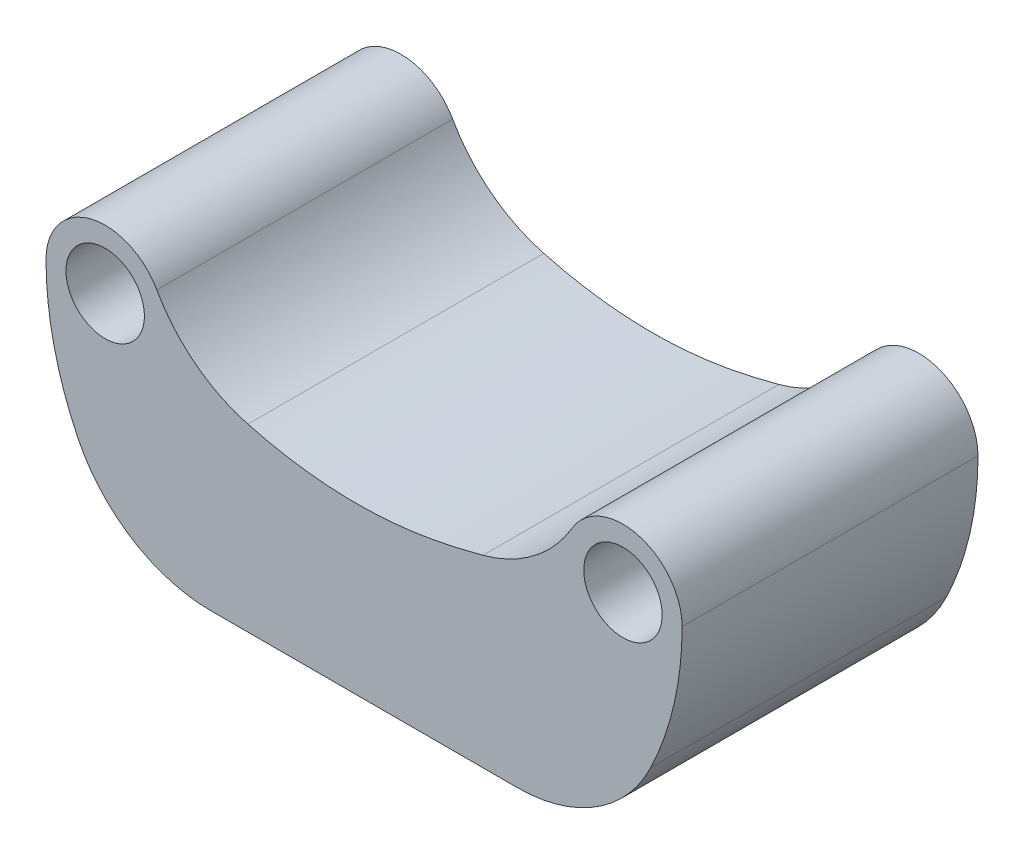
ISO-10303-21;
HEADER;
FILE_DESCRIPTION(('STEP AP214'),'2;1');
FILE_NAME('part.step','',(''),(''),'','','');
FILE_SCHEMA(('AUTOMOTIVE_DESIGN { 1 0 10303 214 1 1 1 1 }'));
ENDSEC;
DATA;
#1=APPLICATION_CONTEXT('core data for automotive mechanical design processes');
#2=APPLICATION_PROTOCOL_DEFINITION('international standard','automotive_design',2000,#1);
#3=PRODUCT_CONTEXT('',#1,'mechanical');
#4=PRODUCT('Part','Part','',(#3));
#5=PRODUCT_RELATED_PRODUCT_CATEGORY('part','',(#4));
#6=PRODUCT_DEFINITION_FORMATION('','',#4);
#7=PRODUCT_DEFINITION_CONTEXT('part definition',#1,'design');
#8=PRODUCT_DEFINITION('design','',#6,#7);
#9=PRODUCT_DEFINITION_SHAPE('','',#8);
#10=(LENGTH_UNIT() NAMED_UNIT(*) SI_UNIT(.MILLI.,.METRE.));
#11=(NAMED_UNIT(*) PLANE_ANGLE_UNIT() SI_UNIT($,.RADIAN.));
#12=(NAMED_UNIT(*) SI_UNIT($,.STERADIAN.) SOLID_ANGLE_UNIT());
#13=UNCERTAINTY_MEASURE_WITH_UNIT(LENGTH_MEASURE(1.E-05),#10,'distance_accuracy_value','');
#14=(GEOMETRIC_REPRESENTATION_CONTEXT(3) GLOBAL_UNCERTAINTY_ASSIGNED_CONTEXT((#13)) GLOBAL_UNIT_ASSIGNED_CONTEXT((#10,
#11,#12)) REPRESENTATION_CONTEXT('',''));
#15=CARTESIAN_POINT('',(0.,0.,0.));
#16=DIRECTION('',(0.,0.,1.));
#17=DIRECTION('',(1.,0.,0.));
#18=AXIS2_PLACEMENT_3D('',#15,#16,#17);
#19=CARTESIAN_POINT('',(0.,0.,0.));
#20=DIRECTION('',(0.,0.,1.));
#21=DIRECTION('',(1.,0.,0.));
#22=AXIS2_PLACEMENT_3D('',#19,#20,#21);
#23=PLANE('',#22);
#24=CARTESIAN_POINT('',(0.,0.,0.));
#25=DIRECTION('',(0.,0.,1.));
#26=DIRECTION('',(1.,0.,0.));
#27=AXIS2_PLACEMENT_3D('',#24,#25,#26);
#28=CIRCLE('',#27,21.5);
#29=CARTESIAN_POINT('',(19.361512013477,-9.34782608695651,0.));
#30=VERTEX_POINT('',#29);
#31=CARTESIAN_POINT('',(21.5,0.,0.));
#32=VERTEX_POINT('',#31);
#33=EDGE_CURVE('E120',#30,#32,#28,.T.);
#34=ORIENTED_EDGE('',*,*,#33,.F.);
#35=CARTESIAN_POINT('',(10.356157588604,-5.,0.));
#36=DIRECTION('',(0.,0.,1.));
#37=DIRECTION('',(1.,0.,0.));
#38=AXIS2_PLACEMENT_3D('',#35,#36,#37);
#39=CIRCLE('',#38,10.);
#40=CARTESIAN_POINT('',(10.356157588604,-15.,0.));
#41=VERTEX_POINT('',#40);
#42=EDGE_CURVE('E279',#30,#41,#39,.F.);
#43=ORIENTED_EDGE('',*,*,#42,.T.);
#44=DIRECTION('',(1.,0.,0.));
#45=VECTOR('',#44,1.);
#46=CARTESIAN_POINT('',(-15.4029218007494,-15.,0.));
#47=LINE('',#46,#45);
#48=CARTESIAN_POINT('',(-10.356157588604,-15.,0.));
#49=VERTEX_POINT('',#48);
#50=EDGE_CURVE('E162',#49,#41,#47,.T.);
#51=ORIENTED_EDGE('',*,*,#50,.F.);
#52=CARTESIAN_POINT('',(-10.356157588604,-5.,0.));
#53=DIRECTION('',(0.,0.,1.));
#54=DIRECTION('',(1.,0.,0.));
#55=AXIS2_PLACEMENT_3D('',#52,#53,#54);
#56=CIRCLE('',#55,10.);
#57=CARTESIAN_POINT('',(-19.361512013477,-9.34782608695652,0.));
#58=VERTEX_POINT('',#57);
#59=EDGE_CURVE('E280',#49,#58,#56,.F.);
#60=ORIENTED_EDGE('',*,*,#59,.T.);
#61=CARTESIAN_POINT('',(0.,0.,0.));
#62=DIRECTION('',(0.,0.,1.));
#63=DIRECTION('',(1.,0.,0.));
#64=AXIS2_PLACEMENT_3D('',#61,#62,#63);
#65=CIRCLE('',#64,21.5);
#66=CARTESIAN_POINT('',(-21.5,0.,0.));
#67=VERTEX_POINT('',#66);
#68=EDGE_CURVE('E163',#67,#58,#65,.T.);
#69=ORIENTED_EDGE('',*,*,#68,.F.);
#70=CARTESIAN_POINT('',(-17.5,0.,0.));
#71=DIRECTION('',(0.,0.,1.));
#72=DIRECTION('',(1.,0.,0.));
#73=AXIS2_PLACEMENT_3D('',#70,#71,#72);
#74=CIRCLE('',#73,4.);
#75=CARTESIAN_POINT('',(-14.009724205155,1.95396388807956,0.));
#76=VERTEX_POINT('',#75);
#77=EDGE_CURVE('E159',#76,#67,#74,.T.);
#78=ORIENTED_EDGE('',*,*,#77,.F.);
#79=CARTESIAN_POINT('',(-5.28403471804245,6.83887360827846,0.));
#80=DIRECTION('',(0.,0.,-1.));
#81=DIRECTION('',(-1.,0.,0.));
#82=AXIS2_PLACEMENT_3D('',#79,#80,#81);
#83=CIRCLE('',#82,10.);
#84=CARTESIAN_POINT('',(-7.85249918215622,-2.82564864047159,0.));
#85=VERTEX_POINT('',#84);
#86=EDGE_CURVE('E155',#85,#76,#83,.T.);
#87=ORIENTED_EDGE('',*,*,#86,.F.);
#88=CARTESIAN_POINT('',(8.04085902458629,-2.55556091291982,0.));
#89=CARTESIAN_POINT('',(5.05697754250554,-3.36160943568467,0.));
#90=CARTESIAN_POINT('',(0.144262576165083,-4.13298074414916,0.));
#91=CARTESIAN_POINT('',(-5.06311863946979,-3.56696048355903,0.));
#92=CARTESIAN_POINT('',(-7.85249918215622,-2.82564864047159,0.));
#93=B_SPLINE_CURVE_WITH_KNOTS('',3,(#88,#89,#90,#91,#92),.UNSPECIFIED.,.F.,.F.,(4,1,4),
(0.17012461896422,0.514602549110944,0.849602566286318),.UNSPECIFIED.);
#94=CARTESIAN_POINT('',(8.04085902458629,-2.55556091291981,0.));
#95=VERTEX_POINT('',#94);
#96=EDGE_CURVE('E150',#95,#85,#93,.T.);
#97=ORIENTED_EDGE('',*,*,#96,.F.);
#98=CARTESIAN_POINT('',(5.4329927307142,7.09840373344625,0.));
#99=DIRECTION('',(0.,0.,-1.));
#100=DIRECTION('',(1.,0.,0.));
#101=AXIS2_PLACEMENT_3D('',#98,#99,#100);
#102=CIRCLE('',#101,10.);
#103=CARTESIAN_POINT('',(14.0522836373469,2.02811535241322,0.));
#104=VERTEX_POINT('',#103);
#105=EDGE_CURVE('E130',#104,#95,#102,.T.);
#106=ORIENTED_EDGE('',*,*,#105,.F.);
#107=CARTESIAN_POINT('',(17.5,0.,0.));
#108=DIRECTION('',(0.,0.,1.));
#109=DIRECTION('',(1.,0.,0.));
#110=AXIS2_PLACEMENT_3D('',#107,#108,#109);
#111=CIRCLE('',#110,4.);
#112=EDGE_CURVE('E126',#32,#104,#111,.T.);
#113=ORIENTED_EDGE('',*,*,#112,.F.);
#114=EDGE_LOOP('',(#34,#43,#51,#60,#69,#78,#87,#97,#106,#113));
#115=FACE_BOUND('',#114,.T.);
#116=CARTESIAN_POINT('',(-17.5,0.,0.));
#117=DIRECTION('',(0.,0.,1.));
#118=DIRECTION('',(1.,0.,0.));
#119=AXIS2_PLACEMENT_3D('',#116,#117,#118);
#120=CIRCLE('',#119,2.65);
#121=CARTESIAN_POINT('',(-14.85,0.,0.));
#122=VERTEX_POINT('',#121);
#123=EDGE_CURVE('E248',#122,#122,#120,.T.);
#124=ORIENTED_EDGE('',*,*,#123,.T.);
#125=EDGE_LOOP('',(#124));
#126=FACE_BOUND('',#125,.T.);
#127=CARTESIAN_POINT('',(17.5,0.,0.));
#128=DIRECTION('',(0.,0.,1.));
#129=DIRECTION('',(1.,0.,0.));
#130=AXIS2_PLACEMENT_3D('',#127,#128,#129);
#131=CIRCLE('',#130,2.65);
#132=CARTESIAN_POINT('',(20.15,0.,0.));
#133=VERTEX_POINT('',#132);
#134=EDGE_CURVE('E243',#133,#133,#131,.T.);
#135=ORIENTED_EDGE('',*,*,#134,.T.);
#136=EDGE_LOOP('',(#135));
#137=FACE_BOUND('',#136,.T.);
#138=ADVANCED_FACE('F33',(#115,#126,#137),#23,.F.);
#139=CARTESIAN_POINT('',(0.,0.,67.0106370941726));
#140=DIRECTION('',(0.,0.,-1.));
#141=DIRECTION('',(-1.,0.,0.));
#142=AXIS2_PLACEMENT_3D('',#139,#140,#141);
#143=CYLINDRICAL_SURFACE('',#142,21.5);
#144=CARTESIAN_POINT('',(0.,0.,20.));
#145=DIRECTION('',(0.,0.,-1.));
#146=DIRECTION('',(-1.,0.,0.));
#147=AXIS2_PLACEMENT_3D('',#144,#145,#146);
#148=CIRCLE('',#147,21.5);
#149=CARTESIAN_POINT('',(21.5,0.,20.));
#150=VERTEX_POINT('',#149);
#151=CARTESIAN_POINT('',(19.361512013477,-9.34782608695651,20.));
#152=VERTEX_POINT('',#151);
#153=EDGE_CURVE('E115',#150,#152,#148,.T.);
#154=ORIENTED_EDGE('',*,*,#153,.T.);
#155=DIRECTION('',(0.,0.,-1.));
#156=VECTOR('',#155,1.);
#157=CARTESIAN_POINT('',(19.361512013477,-9.34782608695651,67.0106370941726));
#158=LINE('',#157,#156);
#159=EDGE_CURVE('E167',#152,#30,#158,.T.);
#160=ORIENTED_EDGE('',*,*,#159,.T.);
#161=ORIENTED_EDGE('',*,*,#33,.T.);
#162=DIRECTION('',(0.,0.,-1.));
#163=VECTOR('',#162,1.);
#164=CARTESIAN_POINT('',(21.5,0.,67.0106370941726));
#165=LINE('',#164,#163);
#166=EDGE_CURVE('E119',#150,#32,#165,.T.);
#167=ORIENTED_EDGE('',*,*,#166,.F.);
#168=EDGE_LOOP('',(#154,#160,#161,#167));
#169=FACE_BOUND('',#168,.T.);
#170=ADVANCED_FACE('F191',(#169),#143,.T.);
#171=CARTESIAN_POINT('',(17.5,0.,67.0106370941726));
#172=DIRECTION('',(0.,0.,-1.));
#173=DIRECTION('',(-1.,0.,0.));
#174=AXIS2_PLACEMENT_3D('',#171,#172,#173);
#175=CYLINDRICAL_SURFACE('',#174,4.);
#176=DIRECTION('',(0.,0.,-1.));
#177=VECTOR('',#176,1.);
#178=CARTESIAN_POINT('',(14.0522836373469,2.02811535241322,67.0106370941726));
#179=LINE('',#178,#177);
#180=CARTESIAN_POINT('',(14.0522836373469,2.02811535241322,20.));
#181=VERTEX_POINT('',#180);
#182=EDGE_CURVE('E123',#181,#104,#179,.T.);
#183=ORIENTED_EDGE('',*,*,#182,.F.);
#184=CARTESIAN_POINT('',(17.5,0.,20.));
#185=DIRECTION('',(0.,0.,-1.));
#186=DIRECTION('',(-1.,0.,0.));
#187=AXIS2_PLACEMENT_3D('',#184,#185,#186);
#188=CIRCLE('',#187,4.);
#189=EDGE_CURVE('E108',#181,#150,#188,.T.);
#190=ORIENTED_EDGE('',*,*,#189,.T.);
#191=ORIENTED_EDGE('',*,*,#166,.T.);
#192=ORIENTED_EDGE('',*,*,#112,.T.);
#193=EDGE_LOOP('',(#183,#190,#191,#192));
#194=FACE_BOUND('',#193,.T.);
#195=ADVANCED_FACE('F124',(#194),#175,.T.);
#196=CARTESIAN_POINT('',(5.4329927307142,7.09840373344625,67.0106370941726));
#197=DIRECTION('',(0.,0.,-1.));
#198=DIRECTION('',(-1.,0.,0.));
#199=AXIS2_PLACEMENT_3D('',#196,#197,#198);
#200=CYLINDRICAL_SURFACE('',#199,10.);
#201=DIRECTION('',(0.,0.,-1.));
#202=VECTOR('',#201,1.);
#203=CARTESIAN_POINT('',(8.04085902458629,-2.55556091291981,67.0106370941726));
#204=LINE('',#203,#202);
#205=CARTESIAN_POINT('',(8.04085902458629,-2.55556091291982,20.));
#206=VERTEX_POINT('',#205);
#207=EDGE_CURVE('E133',#206,#95,#204,.T.);
#208=ORIENTED_EDGE('',*,*,#207,.F.);
#209=CARTESIAN_POINT('',(5.4329927307142,7.09840373344625,20.));
#210=DIRECTION('',(0.,0.,-1.));
#211=DIRECTION('',(-1.,0.,0.));
#212=AXIS2_PLACEMENT_3D('',#209,#210,#211);
#213=CIRCLE('',#212,10.);
#214=EDGE_CURVE('E112',#206,#181,#213,.F.);
#215=ORIENTED_EDGE('',*,*,#214,.T.);
#216=ORIENTED_EDGE('',*,*,#182,.T.);
#217=ORIENTED_EDGE('',*,*,#105,.T.);
#218=EDGE_LOOP('',(#208,#215,#216,#217));
#219=FACE_BOUND('',#218,.T.);
#220=ADVANCED_FACE('F132',(#219),#200,.F.);
#221=CARTESIAN_POINT('',(8.04085902458629,-2.55556091291982,67.0106370941726));
#222=CARTESIAN_POINT('',(5.05697754250554,-3.36160943568467,67.0106370941726));
#223=CARTESIAN_POINT('',(0.144262576165083,-4.13298074414916,67.0106370941726));
#224=CARTESIAN_POINT('',(-5.06311863946979,-3.56696048355903,67.0106370941726));
#225=CARTESIAN_POINT('',(-7.85249918215622,-2.82564864047159,67.0106370941726));
#226=B_SPLINE_CURVE_WITH_KNOTS('',3,(#221,#222,#223,#224,#225),.UNSPECIFIED.,.F.,.F.,(4,1,4),
(0.17012461896422,0.514602549110944,0.849602566286318),.UNSPECIFIED.);
#227=DIRECTION('',(0.,0.,-1.));
#228=VECTOR('',#227,1.);
#229=SURFACE_OF_LINEAR_EXTRUSION('',#226,#228);
#230=DIRECTION('',(0.,0.,-1.));
#231=VECTOR('',#230,1.);
#232=CARTESIAN_POINT('',(-7.85249918215622,-2.82564864047159,67.0106370941726));
#233=LINE('',#232,#231);
#234=CARTESIAN_POINT('',(-7.85249918215622,-2.82564864047159,20.));
#235=VERTEX_POINT('',#234);
#236=EDGE_CURVE('E149',#235,#85,#233,.T.);
#237=ORIENTED_EDGE('',*,*,#236,.F.);
#238=CARTESIAN_POINT('',(8.04085902458629,-2.55556091291982,20.));
#239=CARTESIAN_POINT('',(5.05697754250554,-3.36160943568467,20.));
#240=CARTESIAN_POINT('',(0.144262576165083,-4.13298074414916,20.));
#241=CARTESIAN_POINT('',(-5.06311863946979,-3.56696048355903,20.));
#242=CARTESIAN_POINT('',(-7.85249918215622,-2.82564864047159,20.));
#243=B_SPLINE_CURVE_WITH_KNOTS('',3,(#238,#239,#240,#241,#242),.UNSPECIFIED.,.F.,.F.,(4,1,4),
(0.17012461896422,0.514602549110944,0.849602566286318),.UNSPECIFIED.);
#244=EDGE_CURVE('E139',#235,#206,#243,.F.);
#245=ORIENTED_EDGE('',*,*,#244,.T.);
#246=ORIENTED_EDGE('',*,*,#207,.T.);
#247=ORIENTED_EDGE('',*,*,#96,.T.);
#248=EDGE_LOOP('',(#237,#245,#246,#247));
#249=FACE_BOUND('',#248,.T.);
#250=ADVANCED_FACE('F180',(#249),#229,.F.);
#251=CARTESIAN_POINT('',(-5.28403471804245,6.83887360827846,67.0106370941726));
#252=DIRECTION('',(0.,0.,-1.));
#253=DIRECTION('',(-1.,0.,0.));
#254=AXIS2_PLACEMENT_3D('',#251,#252,#253);
#255=CYLINDRICAL_SURFACE('',#254,10.);
#256=DIRECTION('',(0.,0.,-1.));
#257=VECTOR('',#256,1.);
#258=CARTESIAN_POINT('',(-14.009724205155,1.95396388807956,67.0106370941726));
#259=LINE('',#258,#257);
#260=CARTESIAN_POINT('',(-14.009724205155,1.95396388807956,20.));
#261=VERTEX_POINT('',#260);
#262=EDGE_CURVE('E154',#261,#76,#259,.T.);
#263=ORIENTED_EDGE('',*,*,#262,.F.);
#264=CARTESIAN_POINT('',(-5.28403471804245,6.83887360827846,20.));
#265=DIRECTION('',(0.,0.,-1.));
#266=DIRECTION('',(-1.,0.,0.));
#267=AXIS2_PLACEMENT_3D('',#264,#265,#266);
#268=CIRCLE('',#267,10.);
#269=EDGE_CURVE('E143',#261,#235,#268,.F.);
#270=ORIENTED_EDGE('',*,*,#269,.T.);
#271=ORIENTED_EDGE('',*,*,#236,.T.);
#272=ORIENTED_EDGE('',*,*,#86,.T.);
#273=EDGE_LOOP('',(#263,#270,#271,#272));
#274=FACE_BOUND('',#273,.T.);
#275=ADVANCED_FACE('F184',(#274),#255,.F.);
#276=CARTESIAN_POINT('',(-17.5,0.,67.0106370941726));
#277=DIRECTION('',(0.,0.,-1.));
#278=DIRECTION('',(-1.,0.,0.));
#279=AXIS2_PLACEMENT_3D('',#276,#277,#278);
#280=CYLINDRICAL_SURFACE('',#279,4.);
#281=DIRECTION('',(0.,0.,-1.));
#282=VECTOR('',#281,1.);
#283=CARTESIAN_POINT('',(-21.5,0.,67.0106370941726));
#284=LINE('',#283,#282);
#285=CARTESIAN_POINT('',(-21.5,0.,20.));
#286=VERTEX_POINT('',#285);
#287=EDGE_CURVE('E158',#286,#67,#284,.T.);
#288=ORIENTED_EDGE('',*,*,#287,.F.);
#289=CARTESIAN_POINT('',(-17.5,0.,20.));
#290=DIRECTION('',(0.,0.,-1.));
#291=DIRECTION('',(-1.,0.,0.));
#292=AXIS2_PLACEMENT_3D('',#289,#290,#291);
#293=CIRCLE('',#292,4.);
#294=EDGE_CURVE('E151',#286,#261,#293,.T.);
#295=ORIENTED_EDGE('',*,*,#294,.T.);
#296=ORIENTED_EDGE('',*,*,#262,.T.);
#297=ORIENTED_EDGE('',*,*,#77,.T.);
#298=EDGE_LOOP('',(#288,#295,#296,#297));
#299=FACE_BOUND('',#298,.T.);
#300=ADVANCED_FACE('F227',(#299),#280,.T.);
#301=CARTESIAN_POINT('',(0.,0.,67.0106370941726));
#302=DIRECTION('',(0.,0.,-1.));
#303=DIRECTION('',(-1.,0.,0.));
#304=AXIS2_PLACEMENT_3D('',#301,#302,#303);
#305=CYLINDRICAL_SURFACE('',#304,21.5);
#306=ORIENTED_EDGE('',*,*,#68,.T.);
#307=DIRECTION('',(0.,0.,-1.));
#308=VECTOR('',#307,1.);
#309=CARTESIAN_POINT('',(-19.361512013477,-9.34782608695652,67.0106370941726));
#310=LINE('',#309,#308);
#311=CARTESIAN_POINT('',(-19.361512013477,-9.34782608695652,20.));
#312=VERTEX_POINT('',#311);
#313=EDGE_CURVE('E11',#58,#312,#310,.F.);
#314=ORIENTED_EDGE('',*,*,#313,.T.);
#315=CARTESIAN_POINT('',(0.,0.,20.));
#316=DIRECTION('',(0.,0.,-1.));
#317=DIRECTION('',(-1.,0.,0.));
#318=AXIS2_PLACEMENT_3D('',#315,#316,#317);
#319=CIRCLE('',#318,21.5);
#320=EDGE_CURVE('E156',#312,#286,#319,.T.);
#321=ORIENTED_EDGE('',*,*,#320,.T.);
#322=ORIENTED_EDGE('',*,*,#287,.T.);
#323=EDGE_LOOP('',(#306,#314,#321,#322));
#324=FACE_BOUND('',#323,.T.);
#325=ADVANCED_FACE('F224',(#324),#305,.T.);
#326=CARTESIAN_POINT('',(-15.4029218007494,-15.,67.0106370941726));
#327=DIRECTION('',(0.,1.,0.));
#328=DIRECTION('',(-1.,0.,0.));
#329=AXIS2_PLACEMENT_3D('',#326,#327,#328);
#330=PLANE('',#329);
#331=ORIENTED_EDGE('',*,*,#50,.T.);
#332=DIRECTION('',(0.,0.,-1.));
#333=VECTOR('',#332,1.);
#334=CARTESIAN_POINT('',(10.356157588604,-15.,67.0106370941726));
#335=LINE('',#334,#333);
#336=CARTESIAN_POINT('',(10.356157588604,-15.,20.));
#337=VERTEX_POINT('',#336);
#338=EDGE_CURVE('E274',#41,#337,#335,.F.);
#339=ORIENTED_EDGE('',*,*,#338,.T.);
#340=DIRECTION('',(-1.,0.,0.));
#341=VECTOR('',#340,1.);
#342=CARTESIAN_POINT('',(-15.4029218007494,-15.,20.));
#343=LINE('',#342,#341);
#344=CARTESIAN_POINT('',(-10.356157588604,-15.,20.));
#345=VERTEX_POINT('',#344);
#346=EDGE_CURVE('E160',#337,#345,#343,.T.);
#347=ORIENTED_EDGE('',*,*,#346,.T.);
#348=DIRECTION('',(0.,0.,-1.));
#349=VECTOR('',#348,1.);
#350=CARTESIAN_POINT('',(-10.356157588604,-15.,67.0106370941726));
#351=LINE('',#350,#349);
#352=EDGE_CURVE('E273',#345,#49,#351,.T.);
#353=ORIENTED_EDGE('',*,*,#352,.T.);
#354=EDGE_LOOP('',(#331,#339,#347,#353));
#355=FACE_BOUND('',#354,.T.);
#356=ADVANCED_FACE('F199',(#355),#330,.F.);
#357=CARTESIAN_POINT('',(-17.5,0.,67.0106370941726));
#358=DIRECTION('',(0.,0.,-1.));
#359=DIRECTION('',(-1.,0.,0.));
#360=AXIS2_PLACEMENT_3D('',#357,#358,#359);
#361=CYLINDRICAL_SURFACE('',#360,2.65);
#362=CARTESIAN_POINT('',(-17.5,0.,20.));
#363=DIRECTION('',(0.,0.,-1.));
#364=DIRECTION('',(-1.,0.,0.));
#365=AXIS2_PLACEMENT_3D('',#362,#363,#364);
#366=CIRCLE('',#365,2.65);
#367=CARTESIAN_POINT('',(-20.15,0.,20.));
#368=VERTEX_POINT('',#367);
#369=EDGE_CURVE('E164',#368,#368,#366,.T.);
#370=ORIENTED_EDGE('',*,*,#369,.F.);
#371=EDGE_LOOP('',(#370));
#372=FACE_BOUND('',#371,.T.);
#373=ORIENTED_EDGE('',*,*,#123,.F.);
#374=EDGE_LOOP('',(#373));
#375=FACE_BOUND('',#374,.T.);
#376=ADVANCED_FACE('F195',(#372,#375),#361,.F.);
#377=CARTESIAN_POINT('',(17.5,0.,67.0106370941726));
#378=DIRECTION('',(0.,0.,-1.));
#379=DIRECTION('',(-1.,0.,0.));
#380=AXIS2_PLACEMENT_3D('',#377,#378,#379);
#381=CYLINDRICAL_SURFACE('',#380,2.65);
#382=CARTESIAN_POINT('',(17.5,0.,20.));
#383=DIRECTION('',(0.,0.,-1.));
#384=DIRECTION('',(-1.,0.,0.));
#385=AXIS2_PLACEMENT_3D('',#382,#383,#384);
#386=CIRCLE('',#385,2.65);
#387=CARTESIAN_POINT('',(14.85,0.,20.));
#388=VERTEX_POINT('',#387);
#389=EDGE_CURVE('E168',#388,#388,#386,.T.);
#390=ORIENTED_EDGE('',*,*,#389,.F.);
#391=EDGE_LOOP('',(#390));
#392=FACE_BOUND('',#391,.T.);
#393=ORIENTED_EDGE('',*,*,#134,.F.);
#394=EDGE_LOOP('',(#393));
#395=FACE_BOUND('',#394,.T.);
#396=ADVANCED_FACE('F198',(#392,#395),#381,.F.);
#397=CARTESIAN_POINT('',(0.,6.49999999999999,20.));
#398=DIRECTION('',(0.,0.,-1.));
#399=DIRECTION('',(-1.,0.,0.));
#400=AXIS2_PLACEMENT_3D('',#397,#398,#399);
#401=PLANE('',#400);
#402=ORIENTED_EDGE('',*,*,#389,.T.);
#403=EDGE_LOOP('',(#402));
#404=FACE_BOUND('',#403,.T.);
#405=ORIENTED_EDGE('',*,*,#369,.T.);
#406=EDGE_LOOP('',(#405));
#407=FACE_BOUND('',#406,.T.);
#408=ORIENTED_EDGE('',*,*,#346,.F.);
#409=CARTESIAN_POINT('',(10.356157588604,-5.,20.));
#410=DIRECTION('',(0.,0.,-1.));
#411=DIRECTION('',(-1.,0.,0.));
#412=AXIS2_PLACEMENT_3D('',#409,#410,#411);
#413=CIRCLE('',#412,10.);
#414=EDGE_CURVE('E41',#337,#152,#413,.F.);
#415=ORIENTED_EDGE('',*,*,#414,.T.);
#416=ORIENTED_EDGE('',*,*,#153,.F.);
#417=ORIENTED_EDGE('',*,*,#189,.F.);
#418=ORIENTED_EDGE('',*,*,#214,.F.);
#419=ORIENTED_EDGE('',*,*,#244,.F.);
#420=ORIENTED_EDGE('',*,*,#269,.F.);
#421=ORIENTED_EDGE('',*,*,#294,.F.);
#422=ORIENTED_EDGE('',*,*,#320,.F.);
#423=CARTESIAN_POINT('',(-10.356157588604,-5.,20.));
#424=DIRECTION('',(0.,0.,-1.));
#425=DIRECTION('',(-1.,0.,0.));
#426=AXIS2_PLACEMENT_3D('',#423,#424,#425);
#427=CIRCLE('',#426,10.);
#428=EDGE_CURVE('E53',#312,#345,#427,.F.);
#429=ORIENTED_EDGE('',*,*,#428,.T.);
#430=EDGE_LOOP('',(#408,#415,#416,#417,#418,#419,#420,#421,#422,#429));
#431=FACE_BOUND('',#430,.T.);
#432=ADVANCED_FACE('F110',(#404,#407,#431),#401,.F.);
#433=CARTESIAN_POINT('',(10.356157588604,-5.,67.0106370941726));
#434=DIRECTION('',(0.,0.,-1.));
#435=DIRECTION('',(-1.,0.,0.));
#436=AXIS2_PLACEMENT_3D('',#433,#434,#435);
#437=CYLINDRICAL_SURFACE('',#436,10.);
#438=ORIENTED_EDGE('',*,*,#414,.F.);
#439=ORIENTED_EDGE('',*,*,#338,.F.);
#440=ORIENTED_EDGE('',*,*,#42,.F.);
#441=ORIENTED_EDGE('',*,*,#159,.F.);
#442=EDGE_LOOP('',(#438,#439,#440,#441));
#443=FACE_BOUND('',#442,.T.);
#444=ADVANCED_FACE('F205',(#443),#437,.T.);
#445=CARTESIAN_POINT('',(-10.356157588604,-5.,67.0106370941726));
#446=DIRECTION('',(0.,0.,-1.));
#447=DIRECTION('',(-1.,0.,0.));
#448=AXIS2_PLACEMENT_3D('',#445,#446,#447);
#449=CYLINDRICAL_SURFACE('',#448,10.);
#450=ORIENTED_EDGE('',*,*,#428,.F.);
#451=ORIENTED_EDGE('',*,*,#313,.F.);
#452=ORIENTED_EDGE('',*,*,#59,.F.);
#453=ORIENTED_EDGE('',*,*,#352,.F.);
#454=EDGE_LOOP('',(#450,#451,#452,#453));
#455=FACE_BOUND('',#454,.T.);
#456=ADVANCED_FACE('F35',(#455),#449,.T.);
#457=CLOSED_SHELL('',(#138,#170,#195,#220,#250,#275,#300,#325,#356,#376,#396,#432,#444,#456));
#458=MANIFOLD_SOLID_BREP('B2',#457);
#459=ADVANCED_BREP_SHAPE_REPRESENTATION('',(#18,#458),#14);
#460=SHAPE_DEFINITION_REPRESENTATION(#9,#459);
ENDSEC;
END-ISO-10303-21;
